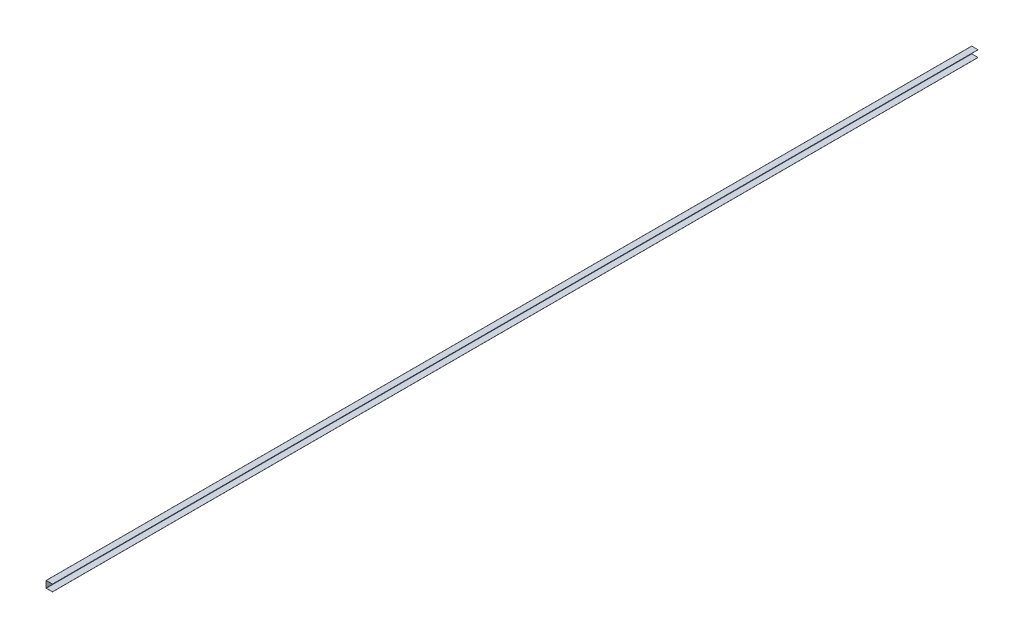
ISO-10303-21;
HEADER;
FILE_DESCRIPTION(('STEP AP214'),'2;1');
FILE_NAME('part.step','',(''),(''),'','','');
FILE_SCHEMA(('AUTOMOTIVE_DESIGN { 1 0 10303 214 1 1 1 1 }'));
ENDSEC;
DATA;
#1=APPLICATION_CONTEXT('core data for automotive mechanical design processes');
#2=APPLICATION_PROTOCOL_DEFINITION('international standard','automotive_design',2000,#1);
#3=PRODUCT_CONTEXT('',#1,'mechanical');
#4=PRODUCT('Part','Part','',(#3));
#5=PRODUCT_RELATED_PRODUCT_CATEGORY('part','',(#4));
#6=PRODUCT_DEFINITION_FORMATION('','',#4);
#7=PRODUCT_DEFINITION_CONTEXT('part definition',#1,'design');
#8=PRODUCT_DEFINITION('design','',#6,#7);
#9=PRODUCT_DEFINITION_SHAPE('','',#8);
#10=(LENGTH_UNIT() NAMED_UNIT(*) SI_UNIT(.MILLI.,.METRE.));
#11=(NAMED_UNIT(*) PLANE_ANGLE_UNIT() SI_UNIT($,.RADIAN.));
#12=(NAMED_UNIT(*) SI_UNIT($,.STERADIAN.) SOLID_ANGLE_UNIT());
#13=UNCERTAINTY_MEASURE_WITH_UNIT(LENGTH_MEASURE(1.E-05),#10,'distance_accuracy_value','');
#14=(GEOMETRIC_REPRESENTATION_CONTEXT(3) GLOBAL_UNCERTAINTY_ASSIGNED_CONTEXT((#13)) GLOBAL_UNIT_ASSIGNED_CONTEXT((#10,
#11,#12)) REPRESENTATION_CONTEXT('',''));
#15=CARTESIAN_POINT('',(0.,0.,0.));
#16=DIRECTION('',(0.,0.,1.));
#17=DIRECTION('',(1.,0.,0.));
#18=AXIS2_PLACEMENT_3D('',#15,#16,#17);
#19=CARTESIAN_POINT('',(0.749999999999994,14.,-3926.));
#20=DIRECTION('',(0.,0.,-1.));
#21=DIRECTION('',(-1.,0.,0.));
#22=AXIS2_PLACEMENT_3D('',#19,#20,#21);
#23=PLANE('',#22);
#24=DIRECTION('',(0.,1.,0.));
#25=VECTOR('',#24,1.);
#26=CARTESIAN_POINT('',(0.749999999999994,14.,-3926.));
#27=LINE('',#26,#25);
#28=CARTESIAN_POINT('',(0.749999999999994,14.,-3926.));
#29=VERTEX_POINT('',#28);
#30=CARTESIAN_POINT('',(0.749999999999993,14.5,-3926.));
#31=VERTEX_POINT('',#30);
#32=EDGE_CURVE('E11',#29,#31,#27,.T.);
#33=ORIENTED_EDGE('',*,*,#32,.F.);
#34=CARTESIAN_POINT('',(0.749999999999994,13.25,-3926.));
#35=DIRECTION('',(0.,0.,-1.));
#36=DIRECTION('',(-1.,0.,0.));
#37=AXIS2_PLACEMENT_3D('',#34,#35,#36);
#38=CIRCLE('',#37,0.75);
#39=CARTESIAN_POINT('',(0.,13.25,-3926.));
#40=VERTEX_POINT('',#39);
#41=EDGE_CURVE('E142',#29,#40,#38,.F.);
#42=ORIENTED_EDGE('',*,*,#41,.T.);
#43=DIRECTION('',(1.,0.,0.));
#44=VECTOR('',#43,1.);
#45=CARTESIAN_POINT('',(-0.500000000000005,13.25,-3926.));
#46=LINE('',#45,#44);
#47=CARTESIAN_POINT('',(-0.500000000000005,13.25,-3926.));
#48=VERTEX_POINT('',#47);
#49=EDGE_CURVE('E46',#48,#40,#46,.T.);
#50=ORIENTED_EDGE('',*,*,#49,.F.);
#51=CARTESIAN_POINT('',(0.749999999999994,13.25,-3926.));
#52=DIRECTION('',(0.,0.,1.));
#53=DIRECTION('',(1.,0.,0.));
#54=AXIS2_PLACEMENT_3D('',#51,#52,#53);
#55=CIRCLE('',#54,1.25);
#56=EDGE_CURVE('E139',#31,#48,#55,.T.);
#57=ORIENTED_EDGE('',*,*,#56,.F.);
#58=EDGE_LOOP('',(#33,#42,#50,#57));
#59=FACE_BOUND('',#58,.T.);
#60=ADVANCED_FACE('F38',(#59),#23,.T.);
#61=CARTESIAN_POINT('',(-0.500000000000005,13.25,-3926.));
#62=DIRECTION('',(0.,0.,-1.));
#63=DIRECTION('',(-1.,0.,0.));
#64=AXIS2_PLACEMENT_3D('',#61,#62,#63);
#65=PLANE('',#64);
#66=DIRECTION('',(-1.,0.,0.));
#67=VECTOR('',#66,1.);
#68=CARTESIAN_POINT('',(27.,14.,-3926.));
#69=LINE('',#68,#67);
#70=CARTESIAN_POINT('',(27.,14.,-3926.));
#71=VERTEX_POINT('',#70);
#72=EDGE_CURVE('E259',#71,#29,#69,.T.);
#73=ORIENTED_EDGE('',*,*,#72,.T.);
#74=ORIENTED_EDGE('',*,*,#32,.T.);
#75=DIRECTION('',(-1.,0.,0.));
#76=VECTOR('',#75,1.);
#77=CARTESIAN_POINT('',(27.,14.5,-3926.));
#78=LINE('',#77,#76);
#79=CARTESIAN_POINT('',(27.,14.5,-3926.));
#80=VERTEX_POINT('',#79);
#81=EDGE_CURVE('E171',#80,#31,#78,.T.);
#82=ORIENTED_EDGE('',*,*,#81,.F.);
#83=DIRECTION('',(0.,-1.,0.));
#84=VECTOR('',#83,1.);
#85=CARTESIAN_POINT('',(27.,14.5,-3926.));
#86=LINE('',#85,#84);
#87=EDGE_CURVE('E173',#80,#71,#86,.T.);
#88=ORIENTED_EDGE('',*,*,#87,.T.);
#89=EDGE_LOOP('',(#73,#74,#82,#88));
#90=FACE_BOUND('',#89,.T.);
#91=ADVANCED_FACE('F270',(#90),#65,.T.);
#92=CARTESIAN_POINT('',(0.,13.25,0.));
#93=DIRECTION('',(0.,0.,1.));
#94=DIRECTION('',(1.,0.,0.));
#95=AXIS2_PLACEMENT_3D('',#92,#93,#94);
#96=PLANE('',#95);
#97=DIRECTION('',(-1.,0.,0.));
#98=VECTOR('',#97,1.);
#99=CARTESIAN_POINT('',(0.,13.25,0.));
#100=LINE('',#99,#98);
#101=CARTESIAN_POINT('',(0.,13.25,0.));
#102=VERTEX_POINT('',#101);
#103=CARTESIAN_POINT('',(-0.500000000000005,13.25,0.));
#104=VERTEX_POINT('',#103);
#105=EDGE_CURVE('E147',#102,#104,#100,.T.);
#106=ORIENTED_EDGE('',*,*,#105,.F.);
#107=CARTESIAN_POINT('',(0.749999999999994,13.25,0.));
#108=DIRECTION('',(0.,0.,-1.));
#109=DIRECTION('',(-1.,0.,0.));
#110=AXIS2_PLACEMENT_3D('',#107,#108,#109);
#111=CIRCLE('',#110,0.75);
#112=CARTESIAN_POINT('',(0.749999999999994,14.,0.));
#113=VERTEX_POINT('',#112);
#114=EDGE_CURVE('E193',#113,#102,#111,.F.);
#115=ORIENTED_EDGE('',*,*,#114,.F.);
#116=DIRECTION('',(0.,-1.,0.));
#117=VECTOR('',#116,1.);
#118=CARTESIAN_POINT('',(0.749999999999993,14.5,0.));
#119=LINE('',#118,#117);
#120=CARTESIAN_POINT('',(0.749999999999993,14.5,0.));
#121=VERTEX_POINT('',#120);
#122=EDGE_CURVE('E239',#121,#113,#119,.T.);
#123=ORIENTED_EDGE('',*,*,#122,.F.);
#124=CARTESIAN_POINT('',(0.749999999999994,13.25,0.));
#125=DIRECTION('',(0.,0.,1.));
#126=DIRECTION('',(1.,0.,0.));
#127=AXIS2_PLACEMENT_3D('',#124,#125,#126);
#128=CIRCLE('',#127,1.25);
#129=EDGE_CURVE('E204',#121,#104,#128,.T.);
#130=ORIENTED_EDGE('',*,*,#129,.T.);
#131=EDGE_LOOP('',(#106,#115,#123,#130));
#132=FACE_BOUND('',#131,.T.);
#133=ADVANCED_FACE('F247',(#132),#96,.T.);
#134=CARTESIAN_POINT('',(0.749999999999993,14.5,0.));
#135=DIRECTION('',(0.,0.,1.));
#136=DIRECTION('',(1.,0.,0.));
#137=AXIS2_PLACEMENT_3D('',#134,#135,#136);
#138=PLANE('',#137);
#139=DIRECTION('',(0.,-1.,0.));
#140=VECTOR('',#139,1.);
#141=CARTESIAN_POINT('',(0.,14.,0.));
#142=LINE('',#141,#140);
#143=CARTESIAN_POINT('',(0.,-13.25,0.));
#144=VERTEX_POINT('',#143);
#145=EDGE_CURVE('E190',#102,#144,#142,.T.);
#146=ORIENTED_EDGE('',*,*,#145,.F.);
#147=ORIENTED_EDGE('',*,*,#105,.T.);
#148=DIRECTION('',(0.,-1.,0.));
#149=VECTOR('',#148,1.);
#150=CARTESIAN_POINT('',(-0.500000000000005,14.,0.));
#151=LINE('',#150,#149);
#152=CARTESIAN_POINT('',(-0.499999999999997,-13.25,0.));
#153=VERTEX_POINT('',#152);
#154=EDGE_CURVE('E156',#104,#153,#151,.T.);
#155=ORIENTED_EDGE('',*,*,#154,.T.);
#156=DIRECTION('',(1.,0.,0.));
#157=VECTOR('',#156,1.);
#158=CARTESIAN_POINT('',(-0.499999999999997,-13.25,0.));
#159=LINE('',#158,#157);
#160=EDGE_CURVE('E95',#153,#144,#159,.T.);
#161=ORIENTED_EDGE('',*,*,#160,.T.);
#162=EDGE_LOOP('',(#146,#147,#155,#161));
#163=FACE_BOUND('',#162,.T.);
#164=ADVANCED_FACE('F243',(#163),#138,.T.);
#165=CARTESIAN_POINT('',(0.,-13.25,-3926.));
#166=DIRECTION('',(0.,0.,-1.));
#167=DIRECTION('',(-1.,0.,0.));
#168=AXIS2_PLACEMENT_3D('',#165,#166,#167);
#169=PLANE('',#168);
#170=DIRECTION('',(-1.,0.,0.));
#171=VECTOR('',#170,1.);
#172=CARTESIAN_POINT('',(0.,-13.25,-3926.));
#173=LINE('',#172,#171);
#174=CARTESIAN_POINT('',(0.,-13.25,-3926.));
#175=VERTEX_POINT('',#174);
#176=CARTESIAN_POINT('',(-0.499999999999997,-13.25,-3926.));
#177=VERTEX_POINT('',#176);
#178=EDGE_CURVE('E164',#175,#177,#173,.T.);
#179=ORIENTED_EDGE('',*,*,#178,.F.);
#180=CARTESIAN_POINT('',(0.750000000000003,-13.25,-3926.));
#181=DIRECTION('',(0.,0.,-1.));
#182=DIRECTION('',(-1.,0.,0.));
#183=AXIS2_PLACEMENT_3D('',#180,#181,#182);
#184=CIRCLE('',#183,0.75);
#185=CARTESIAN_POINT('',(0.750000000000004,-14.,-3926.));
#186=VERTEX_POINT('',#185);
#187=EDGE_CURVE('E257',#175,#186,#184,.F.);
#188=ORIENTED_EDGE('',*,*,#187,.T.);
#189=DIRECTION('',(0.,1.,0.));
#190=VECTOR('',#189,1.);
#191=CARTESIAN_POINT('',(0.750000000000004,-14.5,-3926.));
#192=LINE('',#191,#190);
#193=CARTESIAN_POINT('',(0.750000000000004,-14.5,-3926.));
#194=VERTEX_POINT('',#193);
#195=EDGE_CURVE('E54',#194,#186,#192,.T.);
#196=ORIENTED_EDGE('',*,*,#195,.F.);
#197=CARTESIAN_POINT('',(0.750000000000003,-13.25,-3926.));
#198=DIRECTION('',(0.,0.,1.));
#199=DIRECTION('',(1.,0.,0.));
#200=AXIS2_PLACEMENT_3D('',#197,#198,#199);
#201=CIRCLE('',#200,1.25);
#202=EDGE_CURVE('E166',#177,#194,#201,.T.);
#203=ORIENTED_EDGE('',*,*,#202,.F.);
#204=EDGE_LOOP('',(#179,#188,#196,#203));
#205=FACE_BOUND('',#204,.T.);
#206=ADVANCED_FACE('F302',(#205),#169,.T.);
#207=CARTESIAN_POINT('',(0.750000000000004,-14.5,-3926.));
#208=DIRECTION('',(0.,0.,-1.));
#209=DIRECTION('',(-1.,0.,0.));
#210=AXIS2_PLACEMENT_3D('',#207,#208,#209);
#211=PLANE('',#210);
#212=DIRECTION('',(0.,-1.,0.));
#213=VECTOR('',#212,1.);
#214=CARTESIAN_POINT('',(0.,14.,-3926.));
#215=LINE('',#214,#213);
#216=EDGE_CURVE('E255',#40,#175,#215,.T.);
#217=ORIENTED_EDGE('',*,*,#216,.T.);
#218=ORIENTED_EDGE('',*,*,#178,.T.);
#219=DIRECTION('',(0.,-1.,0.));
#220=VECTOR('',#219,1.);
#221=CARTESIAN_POINT('',(-0.500000000000005,14.,-3926.));
#222=LINE('',#221,#220);
#223=EDGE_CURVE('E154',#48,#177,#222,.T.);
#224=ORIENTED_EDGE('',*,*,#223,.F.);
#225=ORIENTED_EDGE('',*,*,#49,.T.);
#226=EDGE_LOOP('',(#217,#218,#224,#225));
#227=FACE_BOUND('',#226,.T.);
#228=ADVANCED_FACE('F163',(#227),#211,.T.);
#229=CARTESIAN_POINT('',(0.750000000000004,-14.,0.));
#230=DIRECTION('',(0.,0.,1.));
#231=DIRECTION('',(1.,0.,0.));
#232=AXIS2_PLACEMENT_3D('',#229,#230,#231);
#233=PLANE('',#232);
#234=DIRECTION('',(0.,-1.,0.));
#235=VECTOR('',#234,1.);
#236=CARTESIAN_POINT('',(0.750000000000004,-14.,0.));
#237=LINE('',#236,#235);
#238=CARTESIAN_POINT('',(0.750000000000004,-14.,0.));
#239=VERTEX_POINT('',#238);
#240=CARTESIAN_POINT('',(0.750000000000004,-14.5,0.));
#241=VERTEX_POINT('',#240);
#242=EDGE_CURVE('E102',#239,#241,#237,.T.);
#243=ORIENTED_EDGE('',*,*,#242,.F.);
#244=CARTESIAN_POINT('',(0.750000000000003,-13.25,0.));
#245=DIRECTION('',(0.,0.,-1.));
#246=DIRECTION('',(-1.,0.,0.));
#247=AXIS2_PLACEMENT_3D('',#244,#245,#246);
#248=CIRCLE('',#247,0.75);
#249=EDGE_CURVE('E187',#144,#239,#248,.F.);
#250=ORIENTED_EDGE('',*,*,#249,.F.);
#251=ORIENTED_EDGE('',*,*,#160,.F.);
#252=CARTESIAN_POINT('',(0.750000000000003,-13.25,0.));
#253=DIRECTION('',(0.,0.,1.));
#254=DIRECTION('',(1.,0.,0.));
#255=AXIS2_PLACEMENT_3D('',#252,#253,#254);
#256=CIRCLE('',#255,1.25);
#257=EDGE_CURVE('E207',#153,#241,#256,.T.);
#258=ORIENTED_EDGE('',*,*,#257,.T.);
#259=EDGE_LOOP('',(#243,#250,#251,#258));
#260=FACE_BOUND('',#259,.T.);
#261=ADVANCED_FACE('F307',(#260),#233,.T.);
#262=CARTESIAN_POINT('',(-0.499999999999997,-13.25,0.));
#263=DIRECTION('',(0.,0.,1.));
#264=DIRECTION('',(1.,0.,0.));
#265=AXIS2_PLACEMENT_3D('',#262,#263,#264);
#266=PLANE('',#265);
#267=DIRECTION('',(1.,0.,0.));
#268=VECTOR('',#267,1.);
#269=CARTESIAN_POINT('',(0.,-14.,0.));
#270=LINE('',#269,#268);
#271=CARTESIAN_POINT('',(27.,-14.,0.));
#272=VERTEX_POINT('',#271);
#273=EDGE_CURVE('E185',#239,#272,#270,.T.);
#274=ORIENTED_EDGE('',*,*,#273,.F.);
#275=ORIENTED_EDGE('',*,*,#242,.T.);
#276=DIRECTION('',(1.,0.,0.));
#277=VECTOR('',#276,1.);
#278=CARTESIAN_POINT('',(0.,-14.5,0.));
#279=LINE('',#278,#277);
#280=CARTESIAN_POINT('',(27.,-14.5,0.));
#281=VERTEX_POINT('',#280);
#282=EDGE_CURVE('E180',#241,#281,#279,.T.);
#283=ORIENTED_EDGE('',*,*,#282,.T.);
#284=DIRECTION('',(0.,-1.,0.));
#285=VECTOR('',#284,1.);
#286=CARTESIAN_POINT('',(27.,-14.,0.));
#287=LINE('',#286,#285);
#288=EDGE_CURVE('E182',#272,#281,#287,.T.);
#289=ORIENTED_EDGE('',*,*,#288,.F.);
#290=EDGE_LOOP('',(#274,#275,#283,#289));
#291=FACE_BOUND('',#290,.T.);
#292=ADVANCED_FACE('F310',(#291),#266,.T.);
#293=CARTESIAN_POINT('',(0.,-14.5,-3926.));
#294=DIRECTION('',(0.,-1.,0.));
#295=DIRECTION('',(1.,0.,0.));
#296=AXIS2_PLACEMENT_3D('',#293,#294,#295);
#297=PLANE('',#296);
#298=ORIENTED_EDGE('',*,*,#282,.F.);
#299=DIRECTION('',(0.,0.,1.));
#300=VECTOR('',#299,1.);
#301=CARTESIAN_POINT('',(0.750000000000004,-14.5,-3926.));
#302=LINE('',#301,#300);
#303=EDGE_CURVE('E210',#194,#241,#302,.T.);
#304=ORIENTED_EDGE('',*,*,#303,.F.);
#305=DIRECTION('',(1.,0.,0.));
#306=VECTOR('',#305,1.);
#307=CARTESIAN_POINT('',(0.,-14.5,-3926.));
#308=LINE('',#307,#306);
#309=CARTESIAN_POINT('',(27.,-14.5,-3926.));
#310=VERTEX_POINT('',#309);
#311=EDGE_CURVE('E209',#194,#310,#308,.T.);
#312=ORIENTED_EDGE('',*,*,#311,.T.);
#313=DIRECTION('',(0.,0.,1.));
#314=VECTOR('',#313,1.);
#315=CARTESIAN_POINT('',(27.,-14.5,-3926.));
#316=LINE('',#315,#314);
#317=EDGE_CURVE('E179',#310,#281,#316,.T.);
#318=ORIENTED_EDGE('',*,*,#317,.T.);
#319=EDGE_LOOP('',(#298,#304,#312,#318));
#320=FACE_BOUND('',#319,.T.);
#321=ADVANCED_FACE('F313',(#320),#297,.T.);
#322=CARTESIAN_POINT('',(0.750000000000003,-13.25,-3926.));
#323=DIRECTION('',(0.,0.,1.));
#324=DIRECTION('',(1.,0.,0.));
#325=AXIS2_PLACEMENT_3D('',#322,#323,#324);
#326=CYLINDRICAL_SURFACE('',#325,1.25);
#327=ORIENTED_EDGE('',*,*,#257,.F.);
#328=DIRECTION('',(0.,0.,1.));
#329=VECTOR('',#328,1.);
#330=CARTESIAN_POINT('',(-0.499999999999997,-13.25,-3926.));
#331=LINE('',#330,#329);
#332=EDGE_CURVE('E160',#177,#153,#331,.T.);
#333=ORIENTED_EDGE('',*,*,#332,.F.);
#334=ORIENTED_EDGE('',*,*,#202,.T.);
#335=ORIENTED_EDGE('',*,*,#303,.T.);
#336=EDGE_LOOP('',(#327,#333,#334,#335));
#337=FACE_BOUND('',#336,.T.);
#338=ADVANCED_FACE('F316',(#337),#326,.T.);
#339=CARTESIAN_POINT('',(-0.500000000000005,14.,-3926.));
#340=DIRECTION('',(-1.,0.,0.));
#341=DIRECTION('',(0.,-1.,0.));
#342=AXIS2_PLACEMENT_3D('',#339,#340,#341);
#343=PLANE('',#342);
#344=ORIENTED_EDGE('',*,*,#154,.F.);
#345=DIRECTION('',(0.,0.,1.));
#346=VECTOR('',#345,1.);
#347=CARTESIAN_POINT('',(-0.500000000000005,13.25,-3926.));
#348=LINE('',#347,#346);
#349=EDGE_CURVE('E152',#48,#104,#348,.T.);
#350=ORIENTED_EDGE('',*,*,#349,.F.);
#351=ORIENTED_EDGE('',*,*,#223,.T.);
#352=ORIENTED_EDGE('',*,*,#332,.T.);
#353=EDGE_LOOP('',(#344,#350,#351,#352));
#354=FACE_BOUND('',#353,.T.);
#355=ADVANCED_FACE('F153',(#354),#343,.T.);
#356=CARTESIAN_POINT('',(0.749999999999994,13.25,-3926.));
#357=DIRECTION('',(0.,0.,1.));
#358=DIRECTION('',(1.,0.,0.));
#359=AXIS2_PLACEMENT_3D('',#356,#357,#358);
#360=CYLINDRICAL_SURFACE('',#359,1.25);
#361=ORIENTED_EDGE('',*,*,#129,.F.);
#362=DIRECTION('',(0.,0.,1.));
#363=VECTOR('',#362,1.);
#364=CARTESIAN_POINT('',(0.749999999999993,14.5,-3926.));
#365=LINE('',#364,#363);
#366=EDGE_CURVE('E161',#31,#121,#365,.T.);
#367=ORIENTED_EDGE('',*,*,#366,.F.);
#368=ORIENTED_EDGE('',*,*,#56,.T.);
#369=ORIENTED_EDGE('',*,*,#349,.T.);
#370=EDGE_LOOP('',(#361,#367,#368,#369));
#371=FACE_BOUND('',#370,.T.);
#372=ADVANCED_FACE('F169',(#371),#360,.T.);
#373=CARTESIAN_POINT('',(27.,14.5,-3926.));
#374=DIRECTION('',(0.,1.,0.));
#375=DIRECTION('',(-1.,0.,0.));
#376=AXIS2_PLACEMENT_3D('',#373,#374,#375);
#377=PLANE('',#376);
#378=DIRECTION('',(-1.,0.,0.));
#379=VECTOR('',#378,1.);
#380=CARTESIAN_POINT('',(27.,14.5,0.));
#381=LINE('',#380,#379);
#382=CARTESIAN_POINT('',(27.,14.5,0.));
#383=VERTEX_POINT('',#382);
#384=EDGE_CURVE('E201',#383,#121,#381,.T.);
#385=ORIENTED_EDGE('',*,*,#384,.F.);
#386=DIRECTION('',(0.,0.,1.));
#387=VECTOR('',#386,1.);
#388=CARTESIAN_POINT('',(27.,14.5,-3926.));
#389=LINE('',#388,#387);
#390=EDGE_CURVE('E214',#80,#383,#389,.T.);
#391=ORIENTED_EDGE('',*,*,#390,.F.);
#392=ORIENTED_EDGE('',*,*,#81,.T.);
#393=ORIENTED_EDGE('',*,*,#366,.T.);
#394=EDGE_LOOP('',(#385,#391,#392,#393));
#395=FACE_BOUND('',#394,.T.);
#396=ADVANCED_FACE('F282',(#395),#377,.T.);
#397=CARTESIAN_POINT('',(27.,14.5,-3926.));
#398=DIRECTION('',(-1.,0.,0.));
#399=DIRECTION('',(0.,0.,1.));
#400=AXIS2_PLACEMENT_3D('',#397,#398,#399);
#401=PLANE('',#400);
#402=DIRECTION('',(0.,-1.,0.));
#403=VECTOR('',#402,1.);
#404=CARTESIAN_POINT('',(27.,14.5,0.));
#405=LINE('',#404,#403);
#406=CARTESIAN_POINT('',(27.,14.,0.));
#407=VERTEX_POINT('',#406);
#408=EDGE_CURVE('E199',#383,#407,#405,.T.);
#409=ORIENTED_EDGE('',*,*,#408,.T.);
#410=DIRECTION('',(0.,0.,1.));
#411=VECTOR('',#410,1.);
#412=CARTESIAN_POINT('',(27.,14.,-3926.));
#413=LINE('',#412,#411);
#414=EDGE_CURVE('E216',#71,#407,#413,.T.);
#415=ORIENTED_EDGE('',*,*,#414,.F.);
#416=ORIENTED_EDGE('',*,*,#87,.F.);
#417=ORIENTED_EDGE('',*,*,#390,.T.);
#418=EDGE_LOOP('',(#409,#415,#416,#417));
#419=FACE_BOUND('',#418,.T.);
#420=ADVANCED_FACE('F273',(#419),#401,.F.);
#421=CARTESIAN_POINT('',(27.,14.,-3926.));
#422=DIRECTION('',(0.,1.,0.));
#423=DIRECTION('',(-1.,0.,0.));
#424=AXIS2_PLACEMENT_3D('',#421,#422,#423);
#425=PLANE('',#424);
#426=DIRECTION('',(-1.,0.,0.));
#427=VECTOR('',#426,1.);
#428=CARTESIAN_POINT('',(27.,14.,0.));
#429=LINE('',#428,#427);
#430=EDGE_CURVE('E196',#407,#113,#429,.T.);
#431=ORIENTED_EDGE('',*,*,#430,.T.);
#432=DIRECTION('',(0.,0.,1.));
#433=VECTOR('',#432,1.);
#434=CARTESIAN_POINT('',(0.749999999999994,14.,-3926.));
#435=LINE('',#434,#433);
#436=EDGE_CURVE('E219',#29,#113,#435,.T.);
#437=ORIENTED_EDGE('',*,*,#436,.F.);
#438=ORIENTED_EDGE('',*,*,#72,.F.);
#439=ORIENTED_EDGE('',*,*,#414,.T.);
#440=EDGE_LOOP('',(#431,#437,#438,#439));
#441=FACE_BOUND('',#440,.T.);
#442=ADVANCED_FACE('F277',(#441),#425,.F.);
#443=CARTESIAN_POINT('',(0.749999999999994,13.25,-3926.));
#444=DIRECTION('',(0.,0.,1.));
#445=DIRECTION('',(1.,0.,0.));
#446=AXIS2_PLACEMENT_3D('',#443,#444,#445);
#447=CYLINDRICAL_SURFACE('',#446,0.75);
#448=ORIENTED_EDGE('',*,*,#114,.T.);
#449=DIRECTION('',(0.,0.,1.));
#450=VECTOR('',#449,1.);
#451=CARTESIAN_POINT('',(0.,13.25,-3926.));
#452=LINE('',#451,#450);
#453=EDGE_CURVE('E222',#40,#102,#452,.T.);
#454=ORIENTED_EDGE('',*,*,#453,.F.);
#455=ORIENTED_EDGE('',*,*,#41,.F.);
#456=ORIENTED_EDGE('',*,*,#436,.T.);
#457=EDGE_LOOP('',(#448,#454,#455,#456));
#458=FACE_BOUND('',#457,.T.);
#459=ADVANCED_FACE('F249',(#458),#447,.F.);
#460=CARTESIAN_POINT('',(0.,14.,-3926.));
#461=DIRECTION('',(-1.,0.,0.));
#462=DIRECTION('',(0.,-1.,0.));
#463=AXIS2_PLACEMENT_3D('',#460,#461,#462);
#464=PLANE('',#463);
#465=ORIENTED_EDGE('',*,*,#145,.T.);
#466=DIRECTION('',(0.,0.,1.));
#467=VECTOR('',#466,1.);
#468=CARTESIAN_POINT('',(0.,-13.25,-3926.));
#469=LINE('',#468,#467);
#470=EDGE_CURVE('E225',#175,#144,#469,.T.);
#471=ORIENTED_EDGE('',*,*,#470,.F.);
#472=ORIENTED_EDGE('',*,*,#216,.F.);
#473=ORIENTED_EDGE('',*,*,#453,.T.);
#474=EDGE_LOOP('',(#465,#471,#472,#473));
#475=FACE_BOUND('',#474,.T.);
#476=ADVANCED_FACE('F253',(#475),#464,.F.);
#477=CARTESIAN_POINT('',(0.750000000000003,-13.25,-3926.));
#478=DIRECTION('',(0.,0.,1.));
#479=DIRECTION('',(1.,0.,0.));
#480=AXIS2_PLACEMENT_3D('',#477,#478,#479);
#481=CYLINDRICAL_SURFACE('',#480,0.75);
#482=ORIENTED_EDGE('',*,*,#249,.T.);
#483=DIRECTION('',(0.,0.,1.));
#484=VECTOR('',#483,1.);
#485=CARTESIAN_POINT('',(0.750000000000004,-14.,-3926.));
#486=LINE('',#485,#484);
#487=EDGE_CURVE('E228',#186,#239,#486,.T.);
#488=ORIENTED_EDGE('',*,*,#487,.F.);
#489=ORIENTED_EDGE('',*,*,#187,.F.);
#490=ORIENTED_EDGE('',*,*,#470,.T.);
#491=EDGE_LOOP('',(#482,#488,#489,#490));
#492=FACE_BOUND('',#491,.T.);
#493=ADVANCED_FACE('F326',(#492),#481,.F.);
#494=CARTESIAN_POINT('',(0.,-14.,-3926.));
#495=DIRECTION('',(0.,-1.,0.));
#496=DIRECTION('',(1.,0.,0.));
#497=AXIS2_PLACEMENT_3D('',#494,#495,#496);
#498=PLANE('',#497);
#499=ORIENTED_EDGE('',*,*,#273,.T.);
#500=DIRECTION('',(0.,0.,1.));
#501=VECTOR('',#500,1.);
#502=CARTESIAN_POINT('',(27.,-14.,-3926.));
#503=LINE('',#502,#501);
#504=CARTESIAN_POINT('',(27.,-14.,-3926.));
#505=VERTEX_POINT('',#504);
#506=EDGE_CURVE('E231',#505,#272,#503,.T.);
#507=ORIENTED_EDGE('',*,*,#506,.F.);
#508=DIRECTION('',(1.,0.,0.));
#509=VECTOR('',#508,1.);
#510=CARTESIAN_POINT('',(0.,-14.,-3926.));
#511=LINE('',#510,#509);
#512=EDGE_CURVE('E261',#186,#505,#511,.T.);
#513=ORIENTED_EDGE('',*,*,#512,.F.);
#514=ORIENTED_EDGE('',*,*,#487,.T.);
#515=EDGE_LOOP('',(#499,#507,#513,#514));
#516=FACE_BOUND('',#515,.T.);
#517=ADVANCED_FACE('F322',(#516),#498,.F.);
#518=CARTESIAN_POINT('',(27.,-14.,-3926.));
#519=DIRECTION('',(-1.,0.,0.));
#520=DIRECTION('',(0.,0.,1.));
#521=AXIS2_PLACEMENT_3D('',#518,#519,#520);
#522=PLANE('',#521);
#523=ORIENTED_EDGE('',*,*,#288,.T.);
#524=ORIENTED_EDGE('',*,*,#317,.F.);
#525=DIRECTION('',(0.,-1.,0.));
#526=VECTOR('',#525,1.);
#527=CARTESIAN_POINT('',(27.,-14.,-3926.));
#528=LINE('',#527,#526);
#529=EDGE_CURVE('E111',#505,#310,#528,.T.);
#530=ORIENTED_EDGE('',*,*,#529,.F.);
#531=ORIENTED_EDGE('',*,*,#506,.T.);
#532=EDGE_LOOP('',(#523,#524,#530,#531));
#533=FACE_BOUND('',#532,.T.);
#534=ADVANCED_FACE('F318',(#533),#522,.F.);
#535=CARTESIAN_POINT('',(0.750000000000003,-13.25,-3926.));
#536=DIRECTION('',(0.,0.,-1.));
#537=DIRECTION('',(-1.,0.,0.));
#538=AXIS2_PLACEMENT_3D('',#535,#536,#537);
#539=PLANE('',#538);
#540=ORIENTED_EDGE('',*,*,#311,.F.);
#541=ORIENTED_EDGE('',*,*,#195,.T.);
#542=ORIENTED_EDGE('',*,*,#512,.T.);
#543=ORIENTED_EDGE('',*,*,#529,.T.);
#544=EDGE_LOOP('',(#540,#541,#542,#543));
#545=FACE_BOUND('',#544,.T.);
#546=ADVANCED_FACE('F321',(#545),#539,.T.);
#547=CARTESIAN_POINT('',(0.750000000000003,-13.25,0.));
#548=DIRECTION('',(0.,0.,-1.));
#549=DIRECTION('',(-1.,0.,0.));
#550=AXIS2_PLACEMENT_3D('',#547,#548,#549);
#551=PLANE('',#550);
#552=ORIENTED_EDGE('',*,*,#384,.T.);
#553=ORIENTED_EDGE('',*,*,#122,.T.);
#554=ORIENTED_EDGE('',*,*,#430,.F.);
#555=ORIENTED_EDGE('',*,*,#408,.F.);
#556=EDGE_LOOP('',(#552,#553,#554,#555));
#557=FACE_BOUND('',#556,.T.);
#558=ADVANCED_FACE('F279',(#557),#551,.F.);
#559=CLOSED_SHELL('',(#60,#91,#133,#164,#206,#228,#261,#292,#321,#338,#355,#372,#396,#420,#442,
#459,#476,#493,#517,#534,#546,#558));
#560=MANIFOLD_SOLID_BREP('B2',#559);
#561=ADVANCED_BREP_SHAPE_REPRESENTATION('',(#18,#560),#14);
#562=SHAPE_DEFINITION_REPRESENTATION(#9,#561);
ENDSEC;
END-ISO-10303-21;
